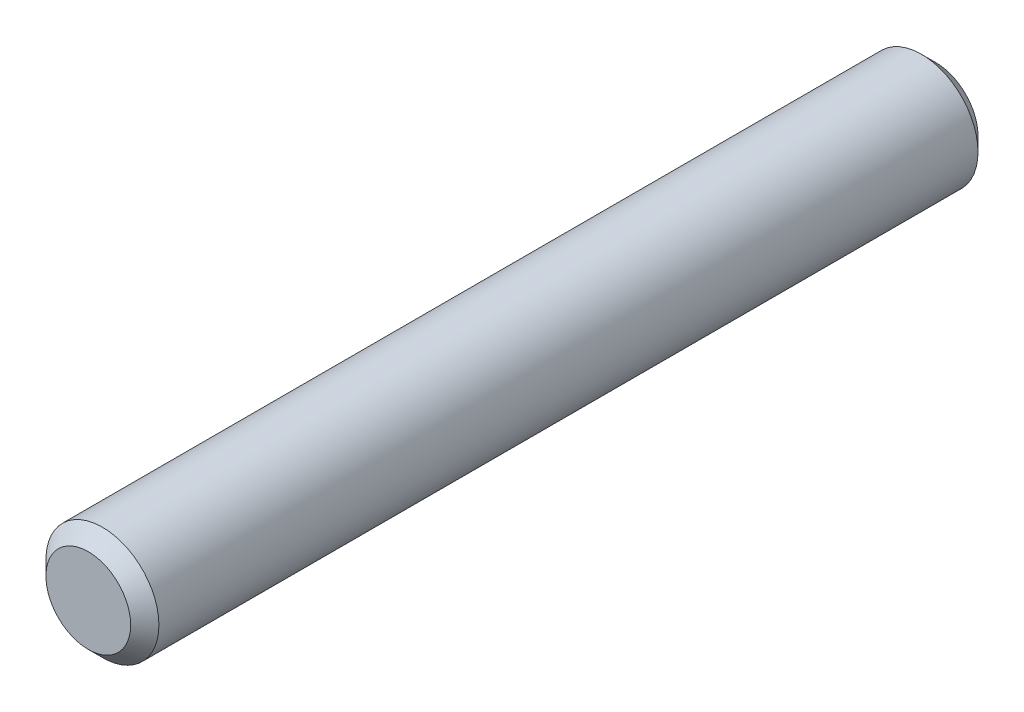
ISO-10303-21;
HEADER;
FILE_DESCRIPTION(('STEP AP214'),'2;1');
FILE_NAME('part.step','',(''),(''),'','','');
FILE_SCHEMA(('AUTOMOTIVE_DESIGN { 1 0 10303 214 1 1 1 1 }'));
ENDSEC;
DATA;
#1=APPLICATION_CONTEXT('core data for automotive mechanical design processes');
#2=APPLICATION_PROTOCOL_DEFINITION('international standard','automotive_design',2000,#1);
#3=PRODUCT_CONTEXT('',#1,'mechanical');
#4=PRODUCT('Part','Part','',(#3));
#5=PRODUCT_RELATED_PRODUCT_CATEGORY('part','',(#4));
#6=PRODUCT_DEFINITION_FORMATION('','',#4);
#7=PRODUCT_DEFINITION_CONTEXT('part definition',#1,'design');
#8=PRODUCT_DEFINITION('design','',#6,#7);
#9=PRODUCT_DEFINITION_SHAPE('','',#8);
#10=(LENGTH_UNIT() NAMED_UNIT(*) SI_UNIT(.MILLI.,.METRE.));
#11=(NAMED_UNIT(*) PLANE_ANGLE_UNIT() SI_UNIT($,.RADIAN.));
#12=(NAMED_UNIT(*) SI_UNIT($,.STERADIAN.) SOLID_ANGLE_UNIT());
#13=UNCERTAINTY_MEASURE_WITH_UNIT(LENGTH_MEASURE(1.E-05),#10,'distance_accuracy_value','');
#14=(GEOMETRIC_REPRESENTATION_CONTEXT(3) GLOBAL_UNCERTAINTY_ASSIGNED_CONTEXT((#13)) GLOBAL_UNIT_ASSIGNED_CONTEXT((#10,
#11,#12)) REPRESENTATION_CONTEXT('',''));
#15=CARTESIAN_POINT('',(0.,0.,0.));
#16=DIRECTION('',(0.,0.,1.));
#17=DIRECTION('',(1.,0.,0.));
#18=AXIS2_PLACEMENT_3D('',#15,#16,#17);
#19=CARTESIAN_POINT('',(0.,0.,30.));
#20=DIRECTION('',(0.,0.,-1.));
#21=DIRECTION('',(-1.,0.,0.));
#22=AXIS2_PLACEMENT_3D('',#19,#20,#21);
#23=CYLINDRICAL_SURFACE('',#22,2.);
#24=CARTESIAN_POINT('',(0.,0.,29.5));
#25=DIRECTION('',(0.,0.,1.));
#26=DIRECTION('',(1.,0.,0.));
#27=AXIS2_PLACEMENT_3D('',#24,#25,#26);
#28=CIRCLE('',#27,2.);
#29=CARTESIAN_POINT('',(2.,0.,29.5));
#30=VERTEX_POINT('',#29);
#31=EDGE_CURVE('E10',#30,#30,#28,.F.);
#32=ORIENTED_EDGE('',*,*,#31,.T.);
#33=EDGE_LOOP('',(#32));
#34=FACE_BOUND('',#33,.T.);
#35=CARTESIAN_POINT('',(0.,0.,0.5));
#36=DIRECTION('',(0.,0.,1.));
#37=DIRECTION('',(1.,0.,0.));
#38=AXIS2_PLACEMENT_3D('',#35,#36,#37);
#39=CIRCLE('',#38,2.);
#40=CARTESIAN_POINT('',(2.,0.,0.5));
#41=VERTEX_POINT('',#40);
#42=EDGE_CURVE('E58',#41,#41,#39,.T.);
#43=ORIENTED_EDGE('',*,*,#42,.T.);
#44=EDGE_LOOP('',(#43));
#45=FACE_BOUND('',#44,.T.);
#46=ADVANCED_FACE('F39',(#34,#45),#23,.T.);
#47=CARTESIAN_POINT('',(0.,0.,30.));
#48=DIRECTION('',(0.,0.,1.));
#49=DIRECTION('',(1.,0.,0.));
#50=AXIS2_PLACEMENT_3D('',#47,#48,#49);
#51=PLANE('',#50);
#52=CARTESIAN_POINT('',(0.,0.,30.));
#53=DIRECTION('',(0.,0.,1.));
#54=DIRECTION('',(1.,0.,0.));
#55=AXIS2_PLACEMENT_3D('',#52,#53,#54);
#56=CIRCLE('',#55,1.5);
#57=CARTESIAN_POINT('',(1.5,0.,30.));
#58=VERTEX_POINT('',#57);
#59=EDGE_CURVE('E48',#58,#58,#56,.T.);
#60=ORIENTED_EDGE('',*,*,#59,.T.);
#61=EDGE_LOOP('',(#60));
#62=FACE_BOUND('',#61,.T.);
#63=ADVANCED_FACE('F75',(#62),#51,.T.);
#64=CARTESIAN_POINT('',(0.,0.,0.));
#65=DIRECTION('',(0.,0.,1.));
#66=DIRECTION('',(1.,0.,0.));
#67=AXIS2_PLACEMENT_3D('',#64,#65,#66);
#68=PLANE('',#67);
#69=CARTESIAN_POINT('',(0.,0.,0.));
#70=DIRECTION('',(0.,0.,1.));
#71=DIRECTION('',(1.,0.,0.));
#72=AXIS2_PLACEMENT_3D('',#69,#70,#71);
#73=CIRCLE('',#72,1.5);
#74=CARTESIAN_POINT('',(1.5,0.,0.));
#75=VERTEX_POINT('',#74);
#76=EDGE_CURVE('E53',#75,#75,#73,.F.);
#77=ORIENTED_EDGE('',*,*,#76,.T.);
#78=EDGE_LOOP('',(#77));
#79=FACE_BOUND('',#78,.T.);
#80=ADVANCED_FACE('F68',(#79),#68,.F.);
#81=CARTESIAN_POINT('',(0.,0.,0.5));
#82=DIRECTION('',(0.,0.,1.));
#83=DIRECTION('',(1.,0.,0.));
#84=AXIS2_PLACEMENT_3D('',#81,#82,#83);
#85=CONICAL_SURFACE('',#84,2.,0.78539816339745);
#86=ORIENTED_EDGE('',*,*,#76,.F.);
#87=EDGE_LOOP('',(#86));
#88=FACE_BOUND('',#87,.T.);
#89=ORIENTED_EDGE('',*,*,#42,.F.);
#90=EDGE_LOOP('',(#89));
#91=FACE_BOUND('',#90,.T.);
#92=ADVANCED_FACE('F66',(#88,#91),#85,.T.);
#93=CARTESIAN_POINT('',(0.,0.,30.));
#94=DIRECTION('',(0.,0.,-1.));
#95=DIRECTION('',(-1.,0.,0.));
#96=AXIS2_PLACEMENT_3D('',#93,#94,#95);
#97=CONICAL_SURFACE('',#96,1.5,0.785398163397447);
#98=ORIENTED_EDGE('',*,*,#31,.F.);
#99=EDGE_LOOP('',(#98));
#100=FACE_BOUND('',#99,.T.);
#101=ORIENTED_EDGE('',*,*,#59,.F.);
#102=EDGE_LOOP('',(#101));
#103=FACE_BOUND('',#102,.T.);
#104=ADVANCED_FACE('F42',(#100,#103),#97,.T.);
#105=CLOSED_SHELL('',(#46,#63,#80,#92,#104));
#106=MANIFOLD_SOLID_BREP('B2',#105);
#107=ADVANCED_BREP_SHAPE_REPRESENTATION('',(#18,#106),#14);
#108=SHAPE_DEFINITION_REPRESENTATION(#9,#107);
ENDSEC;
END-ISO-10303-21;
